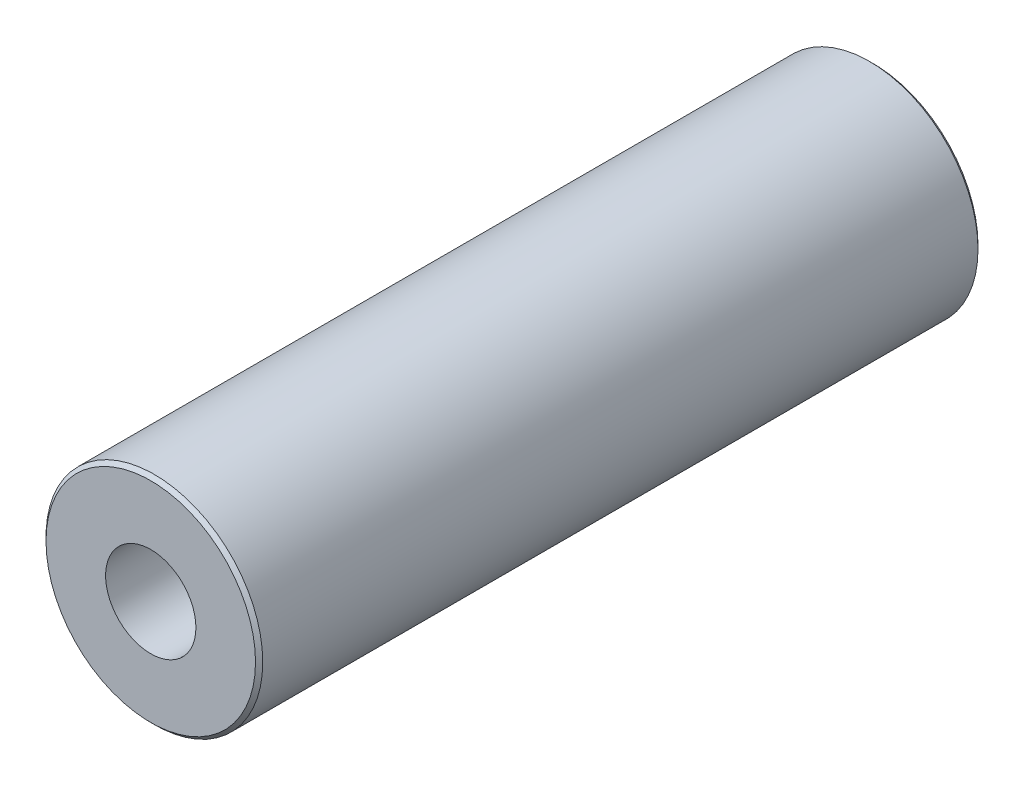
ISO-10303-21;
HEADER;
FILE_DESCRIPTION(('STEP AP214'),'2;1');
FILE_NAME('part.step','',(''),(''),'','','');
FILE_SCHEMA(('AUTOMOTIVE_DESIGN { 1 0 10303 214 1 1 1 1 }'));
ENDSEC;
DATA;
#1=APPLICATION_CONTEXT('core data for automotive mechanical design processes');
#2=APPLICATION_PROTOCOL_DEFINITION('international standard','automotive_design',2000,#1);
#3=PRODUCT_CONTEXT('',#1,'mechanical');
#4=PRODUCT('Part','Part','',(#3));
#5=PRODUCT_RELATED_PRODUCT_CATEGORY('part','',(#4));
#6=PRODUCT_DEFINITION_FORMATION('','',#4);
#7=PRODUCT_DEFINITION_CONTEXT('part definition',#1,'design');
#8=PRODUCT_DEFINITION('design','',#6,#7);
#9=PRODUCT_DEFINITION_SHAPE('','',#8);
#10=(LENGTH_UNIT() NAMED_UNIT(*) SI_UNIT(.MILLI.,.METRE.));
#11=(NAMED_UNIT(*) PLANE_ANGLE_UNIT() SI_UNIT($,.RADIAN.));
#12=(NAMED_UNIT(*) SI_UNIT($,.STERADIAN.) SOLID_ANGLE_UNIT());
#13=UNCERTAINTY_MEASURE_WITH_UNIT(LENGTH_MEASURE(1.E-05),#10,'distance_accuracy_value','');
#14=(GEOMETRIC_REPRESENTATION_CONTEXT(3) GLOBAL_UNCERTAINTY_ASSIGNED_CONTEXT((#13)) GLOBAL_UNIT_ASSIGNED_CONTEXT((#10,
#11,#12)) REPRESENTATION_CONTEXT('',''));
#15=CARTESIAN_POINT('',(0.,0.,0.));
#16=DIRECTION('',(0.,0.,1.));
#17=DIRECTION('',(1.,0.,0.));
#18=AXIS2_PLACEMENT_3D('',#15,#16,#17);
#19=CARTESIAN_POINT('',(0.,0.,10.));
#20=DIRECTION('',(0.,0.,-1.));
#21=DIRECTION('',(-1.,0.,0.));
#22=AXIS2_PLACEMENT_3D('',#19,#20,#21);
#23=CYLINDRICAL_SURFACE('',#22,3.);
#24=CARTESIAN_POINT('',(0.,0.,-9.9));
#25=DIRECTION('',(0.,0.,1.));
#26=DIRECTION('',(1.,0.,0.));
#27=AXIS2_PLACEMENT_3D('',#24,#25,#26);
#28=CIRCLE('',#27,3.);
#29=CARTESIAN_POINT('',(3.,0.,-9.9));
#30=VERTEX_POINT('',#29);
#31=EDGE_CURVE('E52',#30,#30,#28,.T.);
#32=ORIENTED_EDGE('',*,*,#31,.T.);
#33=EDGE_LOOP('',(#32));
#34=FACE_BOUND('',#33,.T.);
#35=CARTESIAN_POINT('',(0.,0.,9.9));
#36=DIRECTION('',(0.,0.,1.));
#37=DIRECTION('',(1.,0.,0.));
#38=AXIS2_PLACEMENT_3D('',#35,#36,#37);
#39=CIRCLE('',#38,3.);
#40=CARTESIAN_POINT('',(3.,0.,9.9));
#41=VERTEX_POINT('',#40);
#42=EDGE_CURVE('E56',#41,#41,#39,.F.);
#43=ORIENTED_EDGE('',*,*,#42,.T.);
#44=EDGE_LOOP('',(#43));
#45=FACE_BOUND('',#44,.T.);
#46=ADVANCED_FACE('F40',(#34,#45),#23,.T.);
#47=CARTESIAN_POINT('',(0.,0.,10.));
#48=DIRECTION('',(0.,0.,1.));
#49=DIRECTION('',(1.,0.,0.));
#50=AXIS2_PLACEMENT_3D('',#47,#48,#49);
#51=PLANE('',#50);
#52=CARTESIAN_POINT('',(0.,0.,10.));
#53=DIRECTION('',(0.,0.,1.));
#54=DIRECTION('',(1.,0.,0.));
#55=AXIS2_PLACEMENT_3D('',#52,#53,#54);
#56=CIRCLE('',#55,1.25);
#57=CARTESIAN_POINT('',(1.25,0.,10.));
#58=VERTEX_POINT('',#57);
#59=EDGE_CURVE('E64',#58,#58,#56,.T.);
#60=ORIENTED_EDGE('',*,*,#59,.F.);
#61=EDGE_LOOP('',(#60));
#62=FACE_BOUND('',#61,.T.);
#63=CARTESIAN_POINT('',(0.,0.,10.));
#64=DIRECTION('',(0.,0.,1.));
#65=DIRECTION('',(1.,0.,0.));
#66=AXIS2_PLACEMENT_3D('',#63,#64,#65);
#67=CIRCLE('',#66,2.9);
#68=CARTESIAN_POINT('',(2.9,0.,10.));
#69=VERTEX_POINT('',#68);
#70=EDGE_CURVE('E10',#69,#69,#67,.T.);
#71=ORIENTED_EDGE('',*,*,#70,.T.);
#72=EDGE_LOOP('',(#71));
#73=FACE_BOUND('',#72,.T.);
#74=ADVANCED_FACE('F70',(#62,#73),#51,.T.);
#75=CARTESIAN_POINT('',(0.,0.,-10.));
#76=DIRECTION('',(0.,0.,1.));
#77=DIRECTION('',(1.,0.,0.));
#78=AXIS2_PLACEMENT_3D('',#75,#76,#77);
#79=PLANE('',#78);
#80=CARTESIAN_POINT('',(0.,0.,-10.));
#81=DIRECTION('',(0.,0.,1.));
#82=DIRECTION('',(1.,0.,0.));
#83=AXIS2_PLACEMENT_3D('',#80,#81,#82);
#84=CIRCLE('',#83,1.25);
#85=CARTESIAN_POINT('',(1.25,0.,-10.));
#86=VERTEX_POINT('',#85);
#87=EDGE_CURVE('E61',#86,#86,#84,.T.);
#88=ORIENTED_EDGE('',*,*,#87,.T.);
#89=EDGE_LOOP('',(#88));
#90=FACE_BOUND('',#89,.T.);
#91=CARTESIAN_POINT('',(0.,0.,-10.));
#92=DIRECTION('',(0.,0.,1.));
#93=DIRECTION('',(1.,0.,0.));
#94=AXIS2_PLACEMENT_3D('',#91,#92,#93);
#95=CIRCLE('',#94,2.9);
#96=CARTESIAN_POINT('',(2.9,0.,-10.));
#97=VERTEX_POINT('',#96);
#98=EDGE_CURVE('E48',#97,#97,#95,.F.);
#99=ORIENTED_EDGE('',*,*,#98,.T.);
#100=EDGE_LOOP('',(#99));
#101=FACE_BOUND('',#100,.T.);
#102=ADVANCED_FACE('F72',(#90,#101),#79,.F.);
#103=CARTESIAN_POINT('',(0.,0.,-9.9));
#104=DIRECTION('',(0.,0.,1.));
#105=DIRECTION('',(1.,0.,0.));
#106=AXIS2_PLACEMENT_3D('',#103,#104,#105);
#107=CONICAL_SURFACE('',#106,3.,0.785398163397455);
#108=ORIENTED_EDGE('',*,*,#98,.F.);
#109=EDGE_LOOP('',(#108));
#110=FACE_BOUND('',#109,.T.);
#111=ORIENTED_EDGE('',*,*,#31,.F.);
#112=EDGE_LOOP('',(#111));
#113=FACE_BOUND('',#112,.T.);
#114=ADVANCED_FACE('F78',(#110,#113),#107,.T.);
#115=CARTESIAN_POINT('',(0.,0.,10.));
#116=DIRECTION('',(0.,0.,-1.));
#117=DIRECTION('',(-1.,0.,0.));
#118=AXIS2_PLACEMENT_3D('',#115,#116,#117);
#119=CONICAL_SURFACE('',#118,2.9,0.78539816339744);
#120=ORIENTED_EDGE('',*,*,#42,.F.);
#121=EDGE_LOOP('',(#120));
#122=FACE_BOUND('',#121,.T.);
#123=ORIENTED_EDGE('',*,*,#70,.F.);
#124=EDGE_LOOP('',(#123));
#125=FACE_BOUND('',#124,.T.);
#126=ADVANCED_FACE('F43',(#122,#125),#119,.T.);
#127=CARTESIAN_POINT('',(0.,0.,10.));
#128=DIRECTION('',(0.,0.,1.));
#129=DIRECTION('',(1.,0.,0.));
#130=AXIS2_PLACEMENT_3D('',#127,#128,#129);
#131=CYLINDRICAL_SURFACE('',#130,1.25);
#132=ORIENTED_EDGE('',*,*,#87,.F.);
#133=EDGE_LOOP('',(#132));
#134=FACE_BOUND('',#133,.T.);
#135=ORIENTED_EDGE('',*,*,#59,.T.);
#136=EDGE_LOOP('',(#135));
#137=FACE_BOUND('',#136,.T.);
#138=ADVANCED_FACE('F68',(#134,#137),#131,.F.);
#139=CLOSED_SHELL('',(#46,#74,#102,#114,#126,#138));
#140=MANIFOLD_SOLID_BREP('B2',#139);
#141=ADVANCED_BREP_SHAPE_REPRESENTATION('',(#18,#140),#14);
#142=SHAPE_DEFINITION_REPRESENTATION(#9,#141);
ENDSEC;
END-ISO-10303-21;
